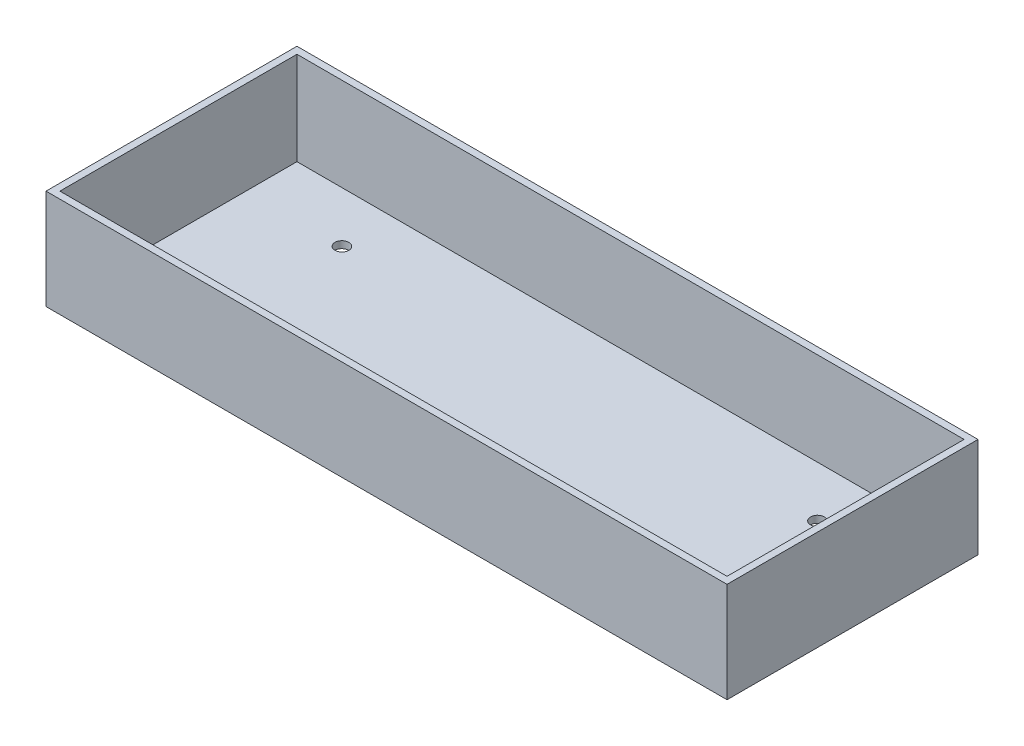
ISO-10303-21;
HEADER;
FILE_DESCRIPTION(('STEP AP214'),'2;1');
FILE_NAME('part.step','',(''),(''),'','','');
FILE_SCHEMA(('AUTOMOTIVE_DESIGN { 1 0 10303 214 1 1 1 1 }'));
ENDSEC;
DATA;
#1=APPLICATION_CONTEXT('core data for automotive mechanical design processes');
#2=APPLICATION_PROTOCOL_DEFINITION('international standard','automotive_design',2000,#1);
#3=PRODUCT_CONTEXT('',#1,'mechanical');
#4=PRODUCT('Part','Part','',(#3));
#5=PRODUCT_RELATED_PRODUCT_CATEGORY('part','',(#4));
#6=PRODUCT_DEFINITION_FORMATION('','',#4);
#7=PRODUCT_DEFINITION_CONTEXT('part definition',#1,'design');
#8=PRODUCT_DEFINITION('design','',#6,#7);
#9=PRODUCT_DEFINITION_SHAPE('','',#8);
#10=(LENGTH_UNIT() NAMED_UNIT(*) SI_UNIT(.MILLI.,.METRE.));
#11=(NAMED_UNIT(*) PLANE_ANGLE_UNIT() SI_UNIT($,.RADIAN.));
#12=(NAMED_UNIT(*) SI_UNIT($,.STERADIAN.) SOLID_ANGLE_UNIT());
#13=UNCERTAINTY_MEASURE_WITH_UNIT(LENGTH_MEASURE(1.E-05),#10,'distance_accuracy_value','');
#14=(GEOMETRIC_REPRESENTATION_CONTEXT(3) GLOBAL_UNCERTAINTY_ASSIGNED_CONTEXT((#13)) GLOBAL_UNIT_ASSIGNED_CONTEXT((#10,
#11,#12)) REPRESENTATION_CONTEXT('',''));
#15=CARTESIAN_POINT('',(0.,0.,0.));
#16=DIRECTION('',(0.,0.,1.));
#17=DIRECTION('',(1.,0.,0.));
#18=AXIS2_PLACEMENT_3D('',#15,#16,#17);
#19=CARTESIAN_POINT('',(0.,28.8,0.));
#20=DIRECTION('',(0.,1.,0.));
#21=DIRECTION('',(0.,0.,1.));
#22=AXIS2_PLACEMENT_3D('',#19,#20,#21);
#23=PLANE('',#22);
#24=DIRECTION('',(1.,0.,0.));
#25=VECTOR('',#24,1.);
#26=CARTESIAN_POINT('',(0.,28.8,0.));
#27=LINE('',#26,#25);
#28=CARTESIAN_POINT('',(0.,28.8,0.));
#29=VERTEX_POINT('',#28);
#30=CARTESIAN_POINT('',(196.2,28.8,0.));
#31=VERTEX_POINT('',#30);
#32=EDGE_CURVE('E212',#29,#31,#27,.T.);
#33=ORIENTED_EDGE('',*,*,#32,.T.);
#34=DIRECTION('',(0.,0.,-1.));
#35=VECTOR('',#34,1.);
#36=CARTESIAN_POINT('',(196.2,28.8,0.));
#37=LINE('',#36,#35);
#38=CARTESIAN_POINT('',(196.2,28.8,-72.3));
#39=VERTEX_POINT('',#38);
#40=EDGE_CURVE('E215',#31,#39,#37,.T.);
#41=ORIENTED_EDGE('',*,*,#40,.T.);
#42=DIRECTION('',(1.,0.,0.));
#43=VECTOR('',#42,1.);
#44=CARTESIAN_POINT('',(0.,28.8,-72.3));
#45=LINE('',#44,#43);
#46=CARTESIAN_POINT('',(0.,28.8,-72.3));
#47=VERTEX_POINT('',#46);
#48=EDGE_CURVE('E218',#47,#39,#45,.T.);
#49=ORIENTED_EDGE('',*,*,#48,.F.);
#50=DIRECTION('',(0.,0.,-1.));
#51=VECTOR('',#50,1.);
#52=CARTESIAN_POINT('',(0.,28.8,0.));
#53=LINE('',#52,#51);
#54=EDGE_CURVE('E221',#29,#47,#53,.T.);
#55=ORIENTED_EDGE('',*,*,#54,.F.);
#56=EDGE_LOOP('',(#33,#41,#49,#55));
#57=FACE_BOUND('',#56,.T.);
#58=DIRECTION('',(0.,0.,-1.));
#59=VECTOR('',#58,1.);
#60=CARTESIAN_POINT('',(194.2,28.8,-2.));
#61=LINE('',#60,#59);
#62=CARTESIAN_POINT('',(194.2,28.8,-2.));
#63=VERTEX_POINT('',#62);
#64=CARTESIAN_POINT('',(194.2,28.8,-70.3));
#65=VERTEX_POINT('',#64);
#66=EDGE_CURVE('E417',#63,#65,#61,.T.);
#67=ORIENTED_EDGE('',*,*,#66,.F.);
#68=DIRECTION('',(1.,0.,0.));
#69=VECTOR('',#68,1.);
#70=CARTESIAN_POINT('',(2.,28.8,-2.));
#71=LINE('',#70,#69);
#72=CARTESIAN_POINT('',(2.,28.8,-2.));
#73=VERTEX_POINT('',#72);
#74=EDGE_CURVE('E202',#73,#63,#71,.T.);
#75=ORIENTED_EDGE('',*,*,#74,.F.);
#76=DIRECTION('',(0.,0.,-1.));
#77=VECTOR('',#76,1.);
#78=CARTESIAN_POINT('',(2.,28.8,-2.));
#79=LINE('',#78,#77);
#80=CARTESIAN_POINT('',(2.,28.8,-70.3));
#81=VERTEX_POINT('',#80);
#82=EDGE_CURVE('E420',#73,#81,#79,.T.);
#83=ORIENTED_EDGE('',*,*,#82,.T.);
#84=DIRECTION('',(1.,0.,0.));
#85=VECTOR('',#84,1.);
#86=CARTESIAN_POINT('',(2.,28.8,-70.3));
#87=LINE('',#86,#85);
#88=EDGE_CURVE('E139',#81,#65,#87,.T.);
#89=ORIENTED_EDGE('',*,*,#88,.T.);
#90=EDGE_LOOP('',(#67,#75,#83,#89));
#91=FACE_BOUND('',#90,.T.);
#92=ADVANCED_FACE('F116',(#57,#91),#23,.T.);
#93=CARTESIAN_POINT('',(0.,0.,0.));
#94=DIRECTION('',(0.,1.,0.));
#95=DIRECTION('',(0.,0.,1.));
#96=AXIS2_PLACEMENT_3D('',#93,#94,#95);
#97=PLANE('',#96);
#98=DIRECTION('',(1.,0.,0.));
#99=VECTOR('',#98,1.);
#100=CARTESIAN_POINT('',(0.,0.,0.));
#101=LINE('',#100,#99);
#102=CARTESIAN_POINT('',(0.,0.,0.));
#103=VERTEX_POINT('',#102);
#104=CARTESIAN_POINT('',(196.2,0.,0.));
#105=VERTEX_POINT('',#104);
#106=EDGE_CURVE('E203',#103,#105,#101,.T.);
#107=ORIENTED_EDGE('',*,*,#106,.F.);
#108=DIRECTION('',(0.,0.,-1.));
#109=VECTOR('',#108,1.);
#110=CARTESIAN_POINT('',(0.,0.,0.));
#111=LINE('',#110,#109);
#112=CARTESIAN_POINT('',(0.,0.,-72.3));
#113=VERTEX_POINT('',#112);
#114=EDGE_CURVE('E216',#103,#113,#111,.T.);
#115=ORIENTED_EDGE('',*,*,#114,.T.);
#116=DIRECTION('',(1.,0.,0.));
#117=VECTOR('',#116,1.);
#118=CARTESIAN_POINT('',(0.,0.,-72.3));
#119=LINE('',#118,#117);
#120=CARTESIAN_POINT('',(196.2,0.,-72.3));
#121=VERTEX_POINT('',#120);
#122=EDGE_CURVE('E227',#113,#121,#119,.T.);
#123=ORIENTED_EDGE('',*,*,#122,.T.);
#124=DIRECTION('',(0.,0.,-1.));
#125=VECTOR('',#124,1.);
#126=CARTESIAN_POINT('',(196.2,0.,0.));
#127=LINE('',#126,#125);
#128=EDGE_CURVE('E206',#105,#121,#127,.T.);
#129=ORIENTED_EDGE('',*,*,#128,.F.);
#130=EDGE_LOOP('',(#107,#115,#123,#129));
#131=FACE_BOUND('',#130,.T.);
#132=CARTESIAN_POINT('',(166.6,0.,-55.65));
#133=DIRECTION('',(0.,-1.,0.));
#134=DIRECTION('',(0.,0.,-1.));
#135=AXIS2_PLACEMENT_3D('',#132,#133,#134);
#136=CIRCLE('',#135,2.);
#137=CARTESIAN_POINT('',(166.6,0.,-57.65));
#138=VERTEX_POINT('',#137);
#139=EDGE_CURVE('E393',#138,#138,#136,.T.);
#140=ORIENTED_EDGE('',*,*,#139,.F.);
#141=EDGE_LOOP('',(#140));
#142=FACE_BOUND('',#141,.T.);
#143=CARTESIAN_POINT('',(29.6,0.,-16.65));
#144=DIRECTION('',(0.,-1.,0.));
#145=DIRECTION('',(0.,0.,-1.));
#146=AXIS2_PLACEMENT_3D('',#143,#144,#145);
#147=CIRCLE('',#146,2.00000000000001);
#148=CARTESIAN_POINT('',(29.6,0.,-18.65));
#149=VERTEX_POINT('',#148);
#150=EDGE_CURVE('E401',#149,#149,#147,.T.);
#151=ORIENTED_EDGE('',*,*,#150,.F.);
#152=EDGE_LOOP('',(#151));
#153=FACE_BOUND('',#152,.T.);
#154=CARTESIAN_POINT('',(29.6,0.,-55.65));
#155=DIRECTION('',(0.,1.,0.));
#156=DIRECTION('',(0.,0.,1.));
#157=AXIS2_PLACEMENT_3D('',#154,#155,#156);
#158=CIRCLE('',#157,2.00000000000001);
#159=CARTESIAN_POINT('',(29.6,0.,-53.65));
#160=VERTEX_POINT('',#159);
#161=EDGE_CURVE('E407',#160,#160,#158,.T.);
#162=ORIENTED_EDGE('',*,*,#161,.T.);
#163=EDGE_LOOP('',(#162));
#164=FACE_BOUND('',#163,.T.);
#165=CARTESIAN_POINT('',(166.6,0.,-16.65));
#166=DIRECTION('',(0.,1.,0.));
#167=DIRECTION('',(0.,0.,1.));
#168=AXIS2_PLACEMENT_3D('',#165,#166,#167);
#169=CIRCLE('',#168,2.);
#170=CARTESIAN_POINT('',(166.6,0.,-14.65));
#171=VERTEX_POINT('',#170);
#172=EDGE_CURVE('E395',#171,#171,#169,.T.);
#173=ORIENTED_EDGE('',*,*,#172,.T.);
#174=EDGE_LOOP('',(#173));
#175=FACE_BOUND('',#174,.T.);
#176=ADVANCED_FACE('F244',(#131,#142,#153,#164,#175),#97,.F.);
#177=CARTESIAN_POINT('',(0.,28.8,0.));
#178=DIRECTION('',(0.,0.,-1.));
#179=DIRECTION('',(-1.,0.,0.));
#180=AXIS2_PLACEMENT_3D('',#177,#178,#179);
#181=PLANE('',#180);
#182=ORIENTED_EDGE('',*,*,#106,.T.);
#183=DIRECTION('',(0.,-1.,0.));
#184=VECTOR('',#183,1.);
#185=CARTESIAN_POINT('',(196.2,28.8,0.));
#186=LINE('',#185,#184);
#187=EDGE_CURVE('E12',#31,#105,#186,.T.);
#188=ORIENTED_EDGE('',*,*,#187,.F.);
#189=ORIENTED_EDGE('',*,*,#32,.F.);
#190=DIRECTION('',(0.,-1.,0.));
#191=VECTOR('',#190,1.);
#192=CARTESIAN_POINT('',(0.,28.8,0.));
#193=LINE('',#192,#191);
#194=EDGE_CURVE('E223',#29,#103,#193,.T.);
#195=ORIENTED_EDGE('',*,*,#194,.T.);
#196=EDGE_LOOP('',(#182,#188,#189,#195));
#197=FACE_BOUND('',#196,.T.);
#198=ADVANCED_FACE('F118',(#197),#181,.F.);
#199=CARTESIAN_POINT('',(196.2,28.8,0.));
#200=DIRECTION('',(-1.,0.,0.));
#201=DIRECTION('',(0.,0.,1.));
#202=AXIS2_PLACEMENT_3D('',#199,#200,#201);
#203=PLANE('',#202);
#204=ORIENTED_EDGE('',*,*,#128,.T.);
#205=DIRECTION('',(0.,-1.,0.));
#206=VECTOR('',#205,1.);
#207=CARTESIAN_POINT('',(196.2,28.8,-72.3));
#208=LINE('',#207,#206);
#209=EDGE_CURVE('E124',#39,#121,#208,.T.);
#210=ORIENTED_EDGE('',*,*,#209,.F.);
#211=ORIENTED_EDGE('',*,*,#40,.F.);
#212=ORIENTED_EDGE('',*,*,#187,.T.);
#213=EDGE_LOOP('',(#204,#210,#211,#212));
#214=FACE_BOUND('',#213,.T.);
#215=ADVANCED_FACE('F240',(#214),#203,.F.);
#216=CARTESIAN_POINT('',(0.,28.8,-72.3));
#217=DIRECTION('',(0.,0.,-1.));
#218=DIRECTION('',(-1.,0.,0.));
#219=AXIS2_PLACEMENT_3D('',#216,#217,#218);
#220=PLANE('',#219);
#221=ORIENTED_EDGE('',*,*,#122,.F.);
#222=DIRECTION('',(0.,-1.,0.));
#223=VECTOR('',#222,1.);
#224=CARTESIAN_POINT('',(0.,28.8,-72.3));
#225=LINE('',#224,#223);
#226=EDGE_CURVE('E233',#47,#113,#225,.T.);
#227=ORIENTED_EDGE('',*,*,#226,.F.);
#228=ORIENTED_EDGE('',*,*,#48,.T.);
#229=ORIENTED_EDGE('',*,*,#209,.T.);
#230=EDGE_LOOP('',(#221,#227,#228,#229));
#231=FACE_BOUND('',#230,.T.);
#232=ADVANCED_FACE('F237',(#231),#220,.T.);
#233=CARTESIAN_POINT('',(0.,28.8,0.));
#234=DIRECTION('',(-1.,0.,0.));
#235=DIRECTION('',(0.,0.,1.));
#236=AXIS2_PLACEMENT_3D('',#233,#234,#235);
#237=PLANE('',#236);
#238=ORIENTED_EDGE('',*,*,#114,.F.);
#239=ORIENTED_EDGE('',*,*,#194,.F.);
#240=ORIENTED_EDGE('',*,*,#54,.T.);
#241=ORIENTED_EDGE('',*,*,#226,.T.);
#242=EDGE_LOOP('',(#238,#239,#240,#241));
#243=FACE_BOUND('',#242,.T.);
#244=ADVANCED_FACE('F248',(#243),#237,.T.);
#245=CARTESIAN_POINT('',(2.,28.8,-2.));
#246=DIRECTION('',(0.,0.,-1.));
#247=DIRECTION('',(-1.,0.,0.));
#248=AXIS2_PLACEMENT_3D('',#245,#246,#247);
#249=PLANE('',#248);
#250=DIRECTION('',(1.,0.,0.));
#251=VECTOR('',#250,1.);
#252=CARTESIAN_POINT('',(2.,2.,-2.));
#253=LINE('',#252,#251);
#254=CARTESIAN_POINT('',(2.,2.,-2.));
#255=VERTEX_POINT('',#254);
#256=CARTESIAN_POINT('',(194.2,2.,-2.));
#257=VERTEX_POINT('',#256);
#258=EDGE_CURVE('E181',#255,#257,#253,.T.);
#259=ORIENTED_EDGE('',*,*,#258,.F.);
#260=DIRECTION('',(0.,-1.,0.));
#261=VECTOR('',#260,1.);
#262=CARTESIAN_POINT('',(2.,28.8,-2.));
#263=LINE('',#262,#261);
#264=EDGE_CURVE('E423',#73,#255,#263,.T.);
#265=ORIENTED_EDGE('',*,*,#264,.F.);
#266=ORIENTED_EDGE('',*,*,#74,.T.);
#267=DIRECTION('',(0.,-1.,0.));
#268=VECTOR('',#267,1.);
#269=CARTESIAN_POINT('',(194.2,28.8,-2.));
#270=LINE('',#269,#268);
#271=EDGE_CURVE('E196',#63,#257,#270,.T.);
#272=ORIENTED_EDGE('',*,*,#271,.T.);
#273=EDGE_LOOP('',(#259,#265,#266,#272));
#274=FACE_BOUND('',#273,.T.);
#275=ADVANCED_FACE('F200',(#274),#249,.T.);
#276=CARTESIAN_POINT('',(194.2,28.8,-2.));
#277=DIRECTION('',(-1.,0.,0.));
#278=DIRECTION('',(0.,0.,1.));
#279=AXIS2_PLACEMENT_3D('',#276,#277,#278);
#280=PLANE('',#279);
#281=DIRECTION('',(0.,0.,-1.));
#282=VECTOR('',#281,1.);
#283=CARTESIAN_POINT('',(194.2,2.,-2.));
#284=LINE('',#283,#282);
#285=CARTESIAN_POINT('',(194.2,2.,-70.3));
#286=VERTEX_POINT('',#285);
#287=EDGE_CURVE('E185',#257,#286,#284,.T.);
#288=ORIENTED_EDGE('',*,*,#287,.F.);
#289=ORIENTED_EDGE('',*,*,#271,.F.);
#290=ORIENTED_EDGE('',*,*,#66,.T.);
#291=DIRECTION('',(0.,-1.,0.));
#292=VECTOR('',#291,1.);
#293=CARTESIAN_POINT('',(194.2,28.8,-70.3));
#294=LINE('',#293,#292);
#295=EDGE_CURVE('E198',#65,#286,#294,.T.);
#296=ORIENTED_EDGE('',*,*,#295,.T.);
#297=EDGE_LOOP('',(#288,#289,#290,#296));
#298=FACE_BOUND('',#297,.T.);
#299=ADVANCED_FACE('F195',(#298),#280,.T.);
#300=CARTESIAN_POINT('',(2.,28.8,-70.3));
#301=DIRECTION('',(0.,0.,-1.));
#302=DIRECTION('',(-1.,0.,0.));
#303=AXIS2_PLACEMENT_3D('',#300,#301,#302);
#304=PLANE('',#303);
#305=DIRECTION('',(0.,-1.,0.));
#306=VECTOR('',#305,1.);
#307=CARTESIAN_POINT('',(2.,28.8,-70.3));
#308=LINE('',#307,#306);
#309=CARTESIAN_POINT('',(2.,2.,-70.3));
#310=VERTEX_POINT('',#309);
#311=EDGE_CURVE('E208',#81,#310,#308,.T.);
#312=ORIENTED_EDGE('',*,*,#311,.T.);
#313=DIRECTION('',(1.,0.,0.));
#314=VECTOR('',#313,1.);
#315=CARTESIAN_POINT('',(2.,2.,-70.3));
#316=LINE('',#315,#314);
#317=EDGE_CURVE('E131',#310,#286,#316,.T.);
#318=ORIENTED_EDGE('',*,*,#317,.T.);
#319=ORIENTED_EDGE('',*,*,#295,.F.);
#320=ORIENTED_EDGE('',*,*,#88,.F.);
#321=EDGE_LOOP('',(#312,#318,#319,#320));
#322=FACE_BOUND('',#321,.T.);
#323=ADVANCED_FACE('F290',(#322),#304,.F.);
#324=CARTESIAN_POINT('',(2.,28.8,-2.));
#325=DIRECTION('',(-1.,0.,0.));
#326=DIRECTION('',(0.,0.,1.));
#327=AXIS2_PLACEMENT_3D('',#324,#325,#326);
#328=PLANE('',#327);
#329=ORIENTED_EDGE('',*,*,#264,.T.);
#330=DIRECTION('',(0.,0.,-1.));
#331=VECTOR('',#330,1.);
#332=CARTESIAN_POINT('',(2.,2.,-2.));
#333=LINE('',#332,#331);
#334=EDGE_CURVE('E186',#255,#310,#333,.T.);
#335=ORIENTED_EDGE('',*,*,#334,.T.);
#336=ORIENTED_EDGE('',*,*,#311,.F.);
#337=ORIENTED_EDGE('',*,*,#82,.F.);
#338=EDGE_LOOP('',(#329,#335,#336,#337));
#339=FACE_BOUND('',#338,.T.);
#340=ADVANCED_FACE('F296',(#339),#328,.F.);
#341=CARTESIAN_POINT('',(0.,2.,0.));
#342=DIRECTION('',(0.,1.,0.));
#343=DIRECTION('',(0.,0.,1.));
#344=AXIS2_PLACEMENT_3D('',#341,#342,#343);
#345=PLANE('',#344);
#346=CARTESIAN_POINT('',(166.6,2.,-55.65));
#347=DIRECTION('',(0.,-1.,0.));
#348=DIRECTION('',(0.,0.,-1.));
#349=AXIS2_PLACEMENT_3D('',#346,#347,#348);
#350=CIRCLE('',#349,2.);
#351=CARTESIAN_POINT('',(166.6,2.,-57.65));
#352=VERTEX_POINT('',#351);
#353=EDGE_CURVE('E390',#352,#352,#350,.T.);
#354=ORIENTED_EDGE('',*,*,#353,.T.);
#355=EDGE_LOOP('',(#354));
#356=FACE_BOUND('',#355,.T.);
#357=CARTESIAN_POINT('',(29.6,2.,-55.65));
#358=DIRECTION('',(0.,1.,0.));
#359=DIRECTION('',(0.,0.,1.));
#360=AXIS2_PLACEMENT_3D('',#357,#358,#359);
#361=CIRCLE('',#360,2.00000000000001);
#362=CARTESIAN_POINT('',(29.6,2.,-53.65));
#363=VERTEX_POINT('',#362);
#364=EDGE_CURVE('E190',#363,#363,#361,.T.);
#365=ORIENTED_EDGE('',*,*,#364,.F.);
#366=EDGE_LOOP('',(#365));
#367=FACE_BOUND('',#366,.T.);
#368=ORIENTED_EDGE('',*,*,#258,.T.);
#369=ORIENTED_EDGE('',*,*,#287,.T.);
#370=ORIENTED_EDGE('',*,*,#317,.F.);
#371=ORIENTED_EDGE('',*,*,#334,.F.);
#372=EDGE_LOOP('',(#368,#369,#370,#371));
#373=FACE_BOUND('',#372,.T.);
#374=CARTESIAN_POINT('',(29.6,2.,-16.65));
#375=DIRECTION('',(0.,-1.,0.));
#376=DIRECTION('',(0.,0.,-1.));
#377=AXIS2_PLACEMENT_3D('',#374,#375,#376);
#378=CIRCLE('',#377,2.00000000000001);
#379=CARTESIAN_POINT('',(29.6,2.,-18.65));
#380=VERTEX_POINT('',#379);
#381=EDGE_CURVE('E404',#380,#380,#378,.T.);
#382=ORIENTED_EDGE('',*,*,#381,.T.);
#383=EDGE_LOOP('',(#382));
#384=FACE_BOUND('',#383,.T.);
#385=CARTESIAN_POINT('',(166.6,2.,-16.65));
#386=DIRECTION('',(0.,1.,0.));
#387=DIRECTION('',(0.,0.,1.));
#388=AXIS2_PLACEMENT_3D('',#385,#386,#387);
#389=CIRCLE('',#388,2.);
#390=CARTESIAN_POINT('',(166.6,2.,-14.65));
#391=VERTEX_POINT('',#390);
#392=EDGE_CURVE('E398',#391,#391,#389,.T.);
#393=ORIENTED_EDGE('',*,*,#392,.F.);
#394=EDGE_LOOP('',(#393));
#395=FACE_BOUND('',#394,.T.);
#396=ADVANCED_FACE('F183',(#356,#367,#373,#384,#395),#345,.T.);
#397=CARTESIAN_POINT('',(29.6,2.,-55.65));
#398=DIRECTION('',(0.,-1.,0.));
#399=DIRECTION('',(0.,0.,-1.));
#400=AXIS2_PLACEMENT_3D('',#397,#398,#399);
#401=CYLINDRICAL_SURFACE('',#400,2.00000000000001);
#402=ORIENTED_EDGE('',*,*,#364,.T.);
#403=EDGE_LOOP('',(#402));
#404=FACE_BOUND('',#403,.T.);
#405=ORIENTED_EDGE('',*,*,#161,.F.);
#406=EDGE_LOOP('',(#405));
#407=FACE_BOUND('',#406,.T.);
#408=ADVANCED_FACE('F310',(#404,#407),#401,.F.);
#409=CARTESIAN_POINT('',(29.6,2.,-16.65));
#410=DIRECTION('',(0.,-1.,0.));
#411=DIRECTION('',(0.,0.,-1.));
#412=AXIS2_PLACEMENT_3D('',#409,#410,#411);
#413=CYLINDRICAL_SURFACE('',#412,2.00000000000001);
#414=ORIENTED_EDGE('',*,*,#381,.F.);
#415=EDGE_LOOP('',(#414));
#416=FACE_BOUND('',#415,.T.);
#417=ORIENTED_EDGE('',*,*,#150,.T.);
#418=EDGE_LOOP('',(#417));
#419=FACE_BOUND('',#418,.T.);
#420=ADVANCED_FACE('F318',(#416,#419),#413,.F.);
#421=CARTESIAN_POINT('',(166.6,2.,-16.65));
#422=DIRECTION('',(0.,-1.,0.));
#423=DIRECTION('',(0.,0.,-1.));
#424=AXIS2_PLACEMENT_3D('',#421,#422,#423);
#425=CYLINDRICAL_SURFACE('',#424,2.);
#426=ORIENTED_EDGE('',*,*,#392,.T.);
#427=EDGE_LOOP('',(#426));
#428=FACE_BOUND('',#427,.T.);
#429=ORIENTED_EDGE('',*,*,#172,.F.);
#430=EDGE_LOOP('',(#429));
#431=FACE_BOUND('',#430,.T.);
#432=ADVANCED_FACE('F326',(#428,#431),#425,.F.);
#433=CARTESIAN_POINT('',(166.6,2.,-55.65));
#434=DIRECTION('',(0.,-1.,0.));
#435=DIRECTION('',(0.,0.,-1.));
#436=AXIS2_PLACEMENT_3D('',#433,#434,#435);
#437=CYLINDRICAL_SURFACE('',#436,2.);
#438=ORIENTED_EDGE('',*,*,#353,.F.);
#439=EDGE_LOOP('',(#438));
#440=FACE_BOUND('',#439,.T.);
#441=ORIENTED_EDGE('',*,*,#139,.T.);
#442=EDGE_LOOP('',(#441));
#443=FACE_BOUND('',#442,.T.);
#444=ADVANCED_FACE('F334',(#440,#443),#437,.F.);
#445=CLOSED_SHELL('',(#92,#176,#198,#215,#232,#244,#275,#299,#323,#340,#396,#408,#420,#432,#444));
#446=MANIFOLD_SOLID_BREP('B2',#445);
#447=ADVANCED_BREP_SHAPE_REPRESENTATION('',(#18,#446),#14);
#448=SHAPE_DEFINITION_REPRESENTATION(#9,#447);
ENDSEC;
END-ISO-10303-21;
